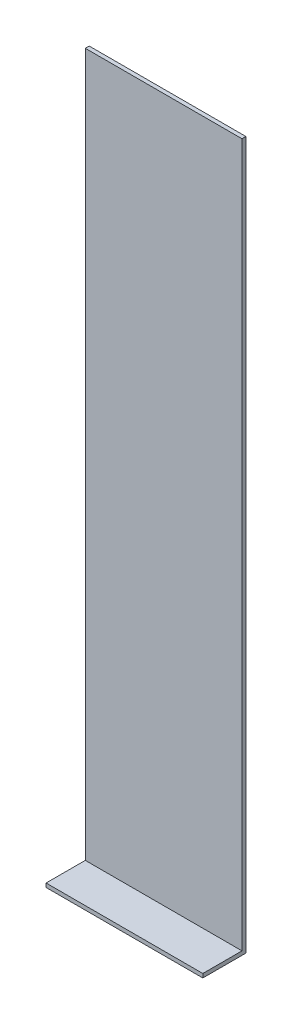
ISO-10303-21;
HEADER;
FILE_DESCRIPTION(('STEP AP214'),'2;1');
FILE_NAME('part.step','',(''),(''),'','','');
FILE_SCHEMA(('AUTOMOTIVE_DESIGN { 1 0 10303 214 1 1 1 1 }'));
ENDSEC;
DATA;
#1=APPLICATION_CONTEXT('core data for automotive mechanical design processes');
#2=APPLICATION_PROTOCOL_DEFINITION('international standard','automotive_design',2000,#1);
#3=PRODUCT_CONTEXT('',#1,'mechanical');
#4=PRODUCT('Part','Part','',(#3));
#5=PRODUCT_RELATED_PRODUCT_CATEGORY('part','',(#4));
#6=PRODUCT_DEFINITION_FORMATION('','',#4);
#7=PRODUCT_DEFINITION_CONTEXT('part definition',#1,'design');
#8=PRODUCT_DEFINITION('design','',#6,#7);
#9=PRODUCT_DEFINITION_SHAPE('','',#8);
#10=(LENGTH_UNIT() NAMED_UNIT(*) SI_UNIT(.MILLI.,.METRE.));
#11=(NAMED_UNIT(*) PLANE_ANGLE_UNIT() SI_UNIT($,.RADIAN.));
#12=(NAMED_UNIT(*) SI_UNIT($,.STERADIAN.) SOLID_ANGLE_UNIT());
#13=UNCERTAINTY_MEASURE_WITH_UNIT(LENGTH_MEASURE(1.E-05),#10,'distance_accuracy_value','');
#14=(GEOMETRIC_REPRESENTATION_CONTEXT(3) GLOBAL_UNCERTAINTY_ASSIGNED_CONTEXT((#13)) GLOBAL_UNIT_ASSIGNED_CONTEXT((#10,
#11,#12)) REPRESENTATION_CONTEXT('',''));
#15=CARTESIAN_POINT('',(0.,0.,0.));
#16=DIRECTION('',(0.,0.,1.));
#17=DIRECTION('',(1.,0.,0.));
#18=AXIS2_PLACEMENT_3D('',#15,#16,#17);
#19=CARTESIAN_POINT('',(200.,1795.07,0.));
#20=DIRECTION('',(0.,0.,-1.));
#21=DIRECTION('',(0.,1.,0.));
#22=AXIS2_PLACEMENT_3D('',#19,#20,#21);
#23=PLANE('',#22);
#24=DIRECTION('',(0.,-1.,0.));
#25=VECTOR('',#24,1.);
#26=CARTESIAN_POINT('',(-200.,1795.07,0.));
#27=LINE('',#26,#25);
#28=CARTESIAN_POINT('',(-200.,1795.07,0.));
#29=VERTEX_POINT('',#28);
#30=CARTESIAN_POINT('',(-200.,0.,0.));
#31=VERTEX_POINT('',#30);
#32=EDGE_CURVE('E117',#29,#31,#27,.T.);
#33=ORIENTED_EDGE('',*,*,#32,.T.);
#34=DIRECTION('',(-1.,0.,0.));
#35=VECTOR('',#34,1.);
#36=CARTESIAN_POINT('',(200.,0.,0.));
#37=LINE('',#36,#35);
#38=CARTESIAN_POINT('',(200.,0.,0.));
#39=VERTEX_POINT('',#38);
#40=EDGE_CURVE('E11',#39,#31,#37,.T.);
#41=ORIENTED_EDGE('',*,*,#40,.F.);
#42=DIRECTION('',(0.,-1.,0.));
#43=VECTOR('',#42,1.);
#44=CARTESIAN_POINT('',(200.,1795.07,0.));
#45=LINE('',#44,#43);
#46=CARTESIAN_POINT('',(200.,1795.07,0.));
#47=VERTEX_POINT('',#46);
#48=EDGE_CURVE('E127',#47,#39,#45,.T.);
#49=ORIENTED_EDGE('',*,*,#48,.F.);
#50=DIRECTION('',(-1.,0.,0.));
#51=VECTOR('',#50,1.);
#52=CARTESIAN_POINT('',(200.,1795.07,0.));
#53=LINE('',#52,#51);
#54=EDGE_CURVE('E113',#47,#29,#53,.T.);
#55=ORIENTED_EDGE('',*,*,#54,.T.);
#56=EDGE_LOOP('',(#33,#41,#49,#55));
#57=FACE_BOUND('',#56,.T.);
#58=ADVANCED_FACE('F33',(#57),#23,.F.);
#59=CARTESIAN_POINT('',(200.,0.,0.));
#60=DIRECTION('',(0.,-1.,0.));
#61=DIRECTION('',(0.,0.,-1.));
#62=AXIS2_PLACEMENT_3D('',#59,#60,#61);
#63=PLANE('',#62);
#64=DIRECTION('',(0.,0.,1.));
#65=VECTOR('',#64,1.);
#66=CARTESIAN_POINT('',(-200.,0.,0.));
#67=LINE('',#66,#65);
#68=CARTESIAN_POINT('',(-200.,0.,100.));
#69=VERTEX_POINT('',#68);
#70=EDGE_CURVE('E120',#31,#69,#67,.T.);
#71=ORIENTED_EDGE('',*,*,#70,.T.);
#72=DIRECTION('',(-1.,0.,0.));
#73=VECTOR('',#72,1.);
#74=CARTESIAN_POINT('',(200.,0.,100.));
#75=LINE('',#74,#73);
#76=CARTESIAN_POINT('',(200.,0.,100.));
#77=VERTEX_POINT('',#76);
#78=EDGE_CURVE('E41',#77,#69,#75,.T.);
#79=ORIENTED_EDGE('',*,*,#78,.F.);
#80=DIRECTION('',(0.,0.,1.));
#81=VECTOR('',#80,1.);
#82=CARTESIAN_POINT('',(200.,0.,0.));
#83=LINE('',#82,#81);
#84=EDGE_CURVE('E86',#39,#77,#83,.T.);
#85=ORIENTED_EDGE('',*,*,#84,.F.);
#86=ORIENTED_EDGE('',*,*,#40,.T.);
#87=EDGE_LOOP('',(#71,#79,#85,#86));
#88=FACE_BOUND('',#87,.T.);
#89=ADVANCED_FACE('F151',(#88),#63,.F.);
#90=CARTESIAN_POINT('',(200.,0.,100.));
#91=DIRECTION('',(0.,0.,-1.));
#92=DIRECTION('',(-1.,0.,0.));
#93=AXIS2_PLACEMENT_3D('',#90,#91,#92);
#94=PLANE('',#93);
#95=DIRECTION('',(0.,-1.,0.));
#96=VECTOR('',#95,1.);
#97=CARTESIAN_POINT('',(-200.,0.,100.));
#98=LINE('',#97,#96);
#99=CARTESIAN_POINT('',(-200.,-10.,100.));
#100=VERTEX_POINT('',#99);
#101=EDGE_CURVE('E122',#69,#100,#98,.T.);
#102=ORIENTED_EDGE('',*,*,#101,.T.);
#103=DIRECTION('',(-1.,0.,0.));
#104=VECTOR('',#103,1.);
#105=CARTESIAN_POINT('',(200.,-10.,100.));
#106=LINE('',#105,#104);
#107=CARTESIAN_POINT('',(200.,-10.,100.));
#108=VERTEX_POINT('',#107);
#109=EDGE_CURVE('E108',#108,#100,#106,.T.);
#110=ORIENTED_EDGE('',*,*,#109,.F.);
#111=DIRECTION('',(0.,-1.,0.));
#112=VECTOR('',#111,1.);
#113=CARTESIAN_POINT('',(200.,0.,100.));
#114=LINE('',#113,#112);
#115=EDGE_CURVE('E99',#77,#108,#114,.T.);
#116=ORIENTED_EDGE('',*,*,#115,.F.);
#117=ORIENTED_EDGE('',*,*,#78,.T.);
#118=EDGE_LOOP('',(#102,#110,#116,#117));
#119=FACE_BOUND('',#118,.T.);
#120=ADVANCED_FACE('F133',(#119),#94,.F.);
#121=CARTESIAN_POINT('',(200.,-10.,100.));
#122=DIRECTION('',(0.,1.,0.));
#123=DIRECTION('',(0.,0.,1.));
#124=AXIS2_PLACEMENT_3D('',#121,#122,#123);
#125=PLANE('',#124);
#126=DIRECTION('',(0.,0.,-1.));
#127=VECTOR('',#126,1.);
#128=CARTESIAN_POINT('',(-200.,-10.,100.));
#129=LINE('',#128,#127);
#130=CARTESIAN_POINT('',(-200.,-10.0000000000002,-10.0000000000002));
#131=VERTEX_POINT('',#130);
#132=EDGE_CURVE('E107',#100,#131,#129,.T.);
#133=ORIENTED_EDGE('',*,*,#132,.T.);
#134=DIRECTION('',(-1.,0.,0.));
#135=VECTOR('',#134,1.);
#136=CARTESIAN_POINT('',(200.,-10.0000000000002,-10.0000000000002));
#137=LINE('',#136,#135);
#138=CARTESIAN_POINT('',(200.,-10.0000000000002,-10.0000000000002));
#139=VERTEX_POINT('',#138);
#140=EDGE_CURVE('E104',#139,#131,#137,.T.);
#141=ORIENTED_EDGE('',*,*,#140,.F.);
#142=DIRECTION('',(0.,0.,-1.));
#143=VECTOR('',#142,1.);
#144=CARTESIAN_POINT('',(200.,-10.,100.));
#145=LINE('',#144,#143);
#146=EDGE_CURVE('E93',#108,#139,#145,.T.);
#147=ORIENTED_EDGE('',*,*,#146,.F.);
#148=ORIENTED_EDGE('',*,*,#109,.T.);
#149=EDGE_LOOP('',(#133,#141,#147,#148));
#150=FACE_BOUND('',#149,.T.);
#151=ADVANCED_FACE('F105',(#150),#125,.F.);
#152=CARTESIAN_POINT('',(200.,-10.0000000000002,-10.0000000000002));
#153=DIRECTION('',(0.,0.,1.));
#154=DIRECTION('',(0.,-1.,0.));
#155=AXIS2_PLACEMENT_3D('',#152,#153,#154);
#156=PLANE('',#155);
#157=DIRECTION('',(0.,1.,0.));
#158=VECTOR('',#157,1.);
#159=CARTESIAN_POINT('',(-200.,-10.0000000000002,-10.0000000000002));
#160=LINE('',#159,#158);
#161=CARTESIAN_POINT('',(-200.,1795.07,-10.0000000000002));
#162=VERTEX_POINT('',#161);
#163=EDGE_CURVE('E72',#131,#162,#160,.T.);
#164=ORIENTED_EDGE('',*,*,#163,.T.);
#165=DIRECTION('',(-1.,0.,0.));
#166=VECTOR('',#165,1.);
#167=CARTESIAN_POINT('',(200.,1795.07,-10.0000000000002));
#168=LINE('',#167,#166);
#169=CARTESIAN_POINT('',(200.,1795.07,-10.0000000000002));
#170=VERTEX_POINT('',#169);
#171=EDGE_CURVE('E109',#170,#162,#168,.T.);
#172=ORIENTED_EDGE('',*,*,#171,.F.);
#173=DIRECTION('',(0.,1.,0.));
#174=VECTOR('',#173,1.);
#175=CARTESIAN_POINT('',(200.,-10.0000000000002,-10.0000000000002));
#176=LINE('',#175,#174);
#177=EDGE_CURVE('E97',#139,#170,#176,.T.);
#178=ORIENTED_EDGE('',*,*,#177,.F.);
#179=ORIENTED_EDGE('',*,*,#140,.T.);
#180=EDGE_LOOP('',(#164,#172,#178,#179));
#181=FACE_BOUND('',#180,.T.);
#182=ADVANCED_FACE('F111',(#181),#156,.F.);
#183=CARTESIAN_POINT('',(200.,1795.07,-10.0000000000002));
#184=DIRECTION('',(0.,-1.,0.));
#185=DIRECTION('',(0.,0.,-1.));
#186=AXIS2_PLACEMENT_3D('',#183,#184,#185);
#187=PLANE('',#186);
#188=DIRECTION('',(0.,0.,1.));
#189=VECTOR('',#188,1.);
#190=CARTESIAN_POINT('',(-200.,1795.07,-10.0000000000002));
#191=LINE('',#190,#189);
#192=EDGE_CURVE('E78',#162,#29,#191,.T.);
#193=ORIENTED_EDGE('',*,*,#192,.T.);
#194=ORIENTED_EDGE('',*,*,#54,.F.);
#195=DIRECTION('',(0.,0.,1.));
#196=VECTOR('',#195,1.);
#197=CARTESIAN_POINT('',(200.,1795.07,-10.0000000000002));
#198=LINE('',#197,#196);
#199=EDGE_CURVE('E49',#170,#47,#198,.T.);
#200=ORIENTED_EDGE('',*,*,#199,.F.);
#201=ORIENTED_EDGE('',*,*,#171,.T.);
#202=EDGE_LOOP('',(#193,#194,#200,#201));
#203=FACE_BOUND('',#202,.T.);
#204=ADVANCED_FACE('F140',(#203),#187,.F.);
#205=CARTESIAN_POINT('',(200.,0.,0.));
#206=DIRECTION('',(-1.,0.,0.));
#207=DIRECTION('',(0.,0.,1.));
#208=AXIS2_PLACEMENT_3D('',#205,#206,#207);
#209=PLANE('',#208);
#210=ORIENTED_EDGE('',*,*,#48,.T.);
#211=ORIENTED_EDGE('',*,*,#84,.T.);
#212=ORIENTED_EDGE('',*,*,#115,.T.);
#213=ORIENTED_EDGE('',*,*,#146,.T.);
#214=ORIENTED_EDGE('',*,*,#177,.T.);
#215=ORIENTED_EDGE('',*,*,#199,.T.);
#216=EDGE_LOOP('',(#210,#211,#212,#213,#214,#215));
#217=FACE_BOUND('',#216,.T.);
#218=ADVANCED_FACE('F95',(#217),#209,.F.);
#219=CARTESIAN_POINT('',(-200.,0.,0.));
#220=DIRECTION('',(-1.,0.,0.));
#221=DIRECTION('',(0.,0.,1.));
#222=AXIS2_PLACEMENT_3D('',#219,#220,#221);
#223=PLANE('',#222);
#224=ORIENTED_EDGE('',*,*,#32,.F.);
#225=ORIENTED_EDGE('',*,*,#192,.F.);
#226=ORIENTED_EDGE('',*,*,#163,.F.);
#227=ORIENTED_EDGE('',*,*,#132,.F.);
#228=ORIENTED_EDGE('',*,*,#101,.F.);
#229=ORIENTED_EDGE('',*,*,#70,.F.);
#230=EDGE_LOOP('',(#224,#225,#226,#227,#228,#229));
#231=FACE_BOUND('',#230,.T.);
#232=ADVANCED_FACE('F136',(#231),#223,.T.);
#233=CLOSED_SHELL('',(#58,#89,#120,#151,#182,#204,#218,#232));
#234=MANIFOLD_SOLID_BREP('B2',#233);
#235=ADVANCED_BREP_SHAPE_REPRESENTATION('',(#18,#234),#14);
#236=SHAPE_DEFINITION_REPRESENTATION(#9,#235);
ENDSEC;
END-ISO-10303-21;
